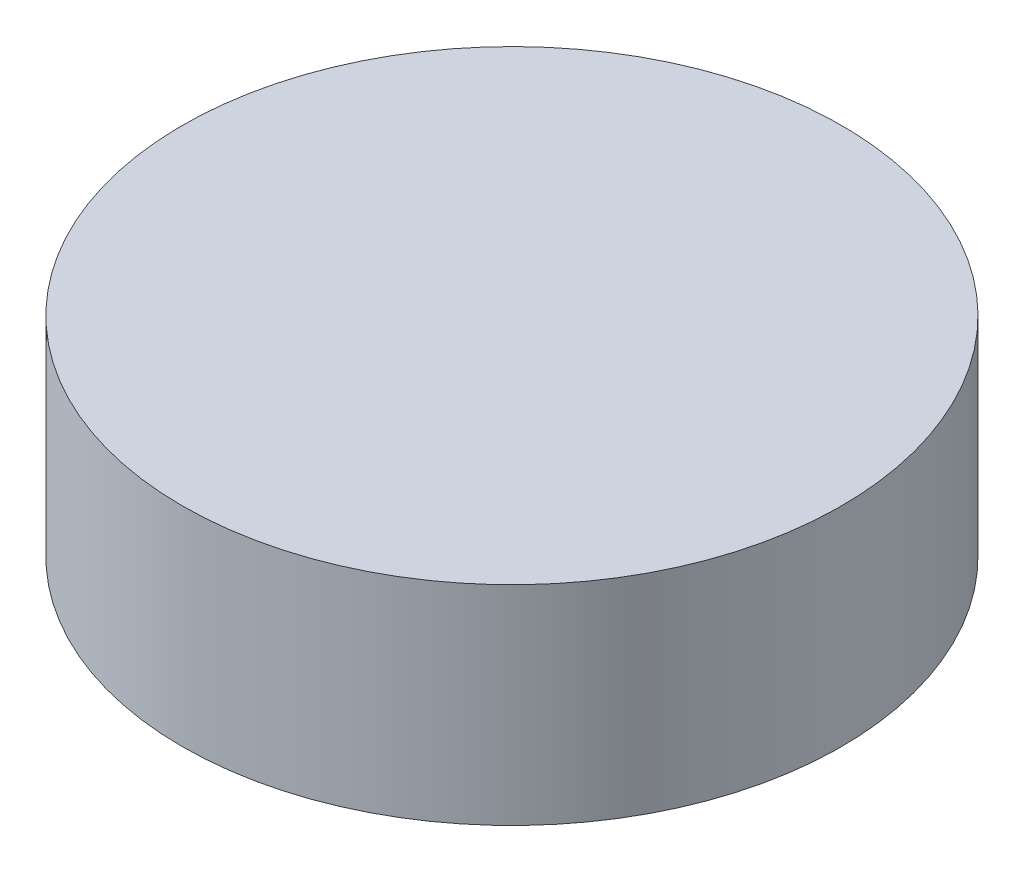
ISO-10303-21;
HEADER;
FILE_DESCRIPTION(('STEP AP214'),'2;1');
FILE_NAME('part.step','',(''),(''),'','','');
FILE_SCHEMA(('AUTOMOTIVE_DESIGN { 1 0 10303 214 1 1 1 1 }'));
ENDSEC;
DATA;
#1=APPLICATION_CONTEXT('core data for automotive mechanical design processes');
#2=APPLICATION_PROTOCOL_DEFINITION('international standard','automotive_design',2000,#1);
#3=PRODUCT_CONTEXT('',#1,'mechanical');
#4=PRODUCT('Part','Part','',(#3));
#5=PRODUCT_RELATED_PRODUCT_CATEGORY('part','',(#4));
#6=PRODUCT_DEFINITION_FORMATION('','',#4);
#7=PRODUCT_DEFINITION_CONTEXT('part definition',#1,'design');
#8=PRODUCT_DEFINITION('design','',#6,#7);
#9=PRODUCT_DEFINITION_SHAPE('','',#8);
#10=(LENGTH_UNIT() NAMED_UNIT(*) SI_UNIT(.MILLI.,.METRE.));
#11=(NAMED_UNIT(*) PLANE_ANGLE_UNIT() SI_UNIT($,.RADIAN.));
#12=(NAMED_UNIT(*) SI_UNIT($,.STERADIAN.) SOLID_ANGLE_UNIT());
#13=UNCERTAINTY_MEASURE_WITH_UNIT(LENGTH_MEASURE(1.E-05),#10,'distance_accuracy_value','');
#14=(GEOMETRIC_REPRESENTATION_CONTEXT(3) GLOBAL_UNCERTAINTY_ASSIGNED_CONTEXT((#13)) GLOBAL_UNIT_ASSIGNED_CONTEXT((#10,
#11,#12)) REPRESENTATION_CONTEXT('',''));
#15=CARTESIAN_POINT('',(0.,0.,0.));
#16=DIRECTION('',(0.,0.,1.));
#17=DIRECTION('',(1.,0.,0.));
#18=AXIS2_PLACEMENT_3D('',#15,#16,#17);
#19=CARTESIAN_POINT('',(47.292360797398,-149.719416551257,96.352860024077));
#20=DIRECTION('',(0.,1.,0.));
#21=DIRECTION('',(0.,0.,1.));
#22=AXIS2_PLACEMENT_3D('',#19,#20,#21);
#23=CYLINDRICAL_SURFACE('',#22,70.25);
#24=CARTESIAN_POINT('',(47.292360797398,48.9775889621627,96.352860024077));
#25=DIRECTION('',(0.,1.,0.));
#26=DIRECTION('',(0.,0.,1.));
#27=AXIS2_PLACEMENT_3D('',#24,#25,#26);
#28=CIRCLE('',#27,70.25);
#29=CARTESIAN_POINT('',(47.292360797398,48.9775889621626,166.602860024077));
#30=VERTEX_POINT('',#29);
#31=EDGE_CURVE('E10',#30,#30,#28,.F.);
#32=CARTESIAN_POINT('',(47.292360797398,93.4275889621627,96.352860024077));
#33=DIRECTION('',(0.,1.,0.));
#34=DIRECTION('',(0.,0.,1.));
#35=AXIS2_PLACEMENT_3D('',#32,#33,#34);
#36=CIRCLE('',#35,70.25);
#37=CARTESIAN_POINT('',(47.292360797398,93.4275889621626,166.602860024077));
#38=VERTEX_POINT('',#37);
#39=EDGE_CURVE('E38',#38,#38,#36,.T.);
#40=CARTESIAN_POINT('',(47.292360797398,48.9775889621626,166.602860024077));
#41=CARTESIAN_POINT('',(47.292360797398,49.440609795496,166.602860024077));
#42=CARTESIAN_POINT('',(47.292360797398,49.9036306288293,166.602860024077));
#43=CARTESIAN_POINT('',(47.292360797398,50.829672295496,166.602860024077));
#44=CARTESIAN_POINT('',(47.292360797398,51.2926931288293,166.602860024077));
#45=CARTESIAN_POINT('',(47.292360797398,52.218734795496,166.602860024077));
#46=CARTESIAN_POINT('',(47.292360797398,52.6817556288293,166.602860024077));
#47=CARTESIAN_POINT('',(47.292360797398,53.607797295496,166.602860024077));
#48=CARTESIAN_POINT('',(47.292360797398,54.0708181288293,166.602860024077));
#49=CARTESIAN_POINT('',(47.292360797398,54.996859795496,166.602860024077));
#50=CARTESIAN_POINT('',(47.292360797398,55.4598806288293,166.602860024077));
#51=CARTESIAN_POINT('',(47.292360797398,56.385922295496,166.602860024077));
#52=CARTESIAN_POINT('',(47.292360797398,56.8489431288293,166.602860024077));
#53=CARTESIAN_POINT('',(47.292360797398,57.774984795496,166.602860024077));
#54=CARTESIAN_POINT('',(47.292360797398,58.2380056288293,166.602860024077));
#55=CARTESIAN_POINT('',(47.292360797398,59.164047295496,166.602860024077));
#56=CARTESIAN_POINT('',(47.292360797398,59.6270681288293,166.602860024077));
#57=CARTESIAN_POINT('',(47.292360797398,60.553109795496,166.602860024077));
#58=CARTESIAN_POINT('',(47.292360797398,61.0161306288293,166.602860024077));
#59=CARTESIAN_POINT('',(47.292360797398,61.942172295496,166.602860024077));
#60=CARTESIAN_POINT('',(47.292360797398,62.4051931288293,166.602860024077));
#61=CARTESIAN_POINT('',(47.292360797398,63.331234795496,166.602860024077));
#62=CARTESIAN_POINT('',(47.292360797398,63.7942556288293,166.602860024077));
#63=CARTESIAN_POINT('',(47.292360797398,64.720297295496,166.602860024077));
#64=CARTESIAN_POINT('',(47.292360797398,65.1833181288293,166.602860024077));
#65=CARTESIAN_POINT('',(47.292360797398,66.109359795496,166.602860024077));
#66=CARTESIAN_POINT('',(47.292360797398,66.5723806288293,166.602860024077));
#67=CARTESIAN_POINT('',(47.292360797398,67.498422295496,166.602860024077));
#68=CARTESIAN_POINT('',(47.292360797398,67.9614431288293,166.602860024077));
#69=CARTESIAN_POINT('',(47.292360797398,68.887484795496,166.602860024077));
#70=CARTESIAN_POINT('',(47.292360797398,69.3505056288293,166.602860024077));
#71=CARTESIAN_POINT('',(47.292360797398,70.276547295496,166.602860024077));
#72=CARTESIAN_POINT('',(47.292360797398,70.7395681288293,166.602860024077));
#73=CARTESIAN_POINT('',(47.292360797398,71.665609795496,166.602860024077));
#74=CARTESIAN_POINT('',(47.292360797398,72.1286306288293,166.602860024077));
#75=CARTESIAN_POINT('',(47.292360797398,73.054672295496,166.602860024077));
#76=CARTESIAN_POINT('',(47.292360797398,73.5176931288293,166.602860024077));
#77=CARTESIAN_POINT('',(47.292360797398,74.443734795496,166.602860024077));
#78=CARTESIAN_POINT('',(47.292360797398,74.9067556288293,166.602860024077));
#79=CARTESIAN_POINT('',(47.292360797398,75.832797295496,166.602860024077));
#80=CARTESIAN_POINT('',(47.292360797398,76.2958181288293,166.602860024077));
#81=CARTESIAN_POINT('',(47.292360797398,77.221859795496,166.602860024077));
#82=CARTESIAN_POINT('',(47.292360797398,77.6848806288293,166.602860024077));
#83=CARTESIAN_POINT('',(47.292360797398,78.610922295496,166.602860024077));
#84=CARTESIAN_POINT('',(47.292360797398,79.0739431288293,166.602860024077));
#85=CARTESIAN_POINT('',(47.292360797398,79.999984795496,166.602860024077));
#86=CARTESIAN_POINT('',(47.292360797398,80.4630056288293,166.602860024077));
#87=CARTESIAN_POINT('',(47.292360797398,81.389047295496,166.602860024077));
#88=CARTESIAN_POINT('',(47.292360797398,81.8520681288293,166.602860024077));
#89=CARTESIAN_POINT('',(47.292360797398,82.778109795496,166.602860024077));
#90=CARTESIAN_POINT('',(47.292360797398,83.2411306288293,166.602860024077));
#91=CARTESIAN_POINT('',(47.292360797398,84.167172295496,166.602860024077));
#92=CARTESIAN_POINT('',(47.292360797398,84.6301931288293,166.602860024077));
#93=CARTESIAN_POINT('',(47.292360797398,85.556234795496,166.602860024077));
#94=CARTESIAN_POINT('',(47.292360797398,86.0192556288293,166.602860024077));
#95=CARTESIAN_POINT('',(47.292360797398,86.945297295496,166.602860024077));
#96=CARTESIAN_POINT('',(47.292360797398,87.4083181288293,166.602860024077));
#97=CARTESIAN_POINT('',(47.292360797398,88.334359795496,166.602860024077));
#98=CARTESIAN_POINT('',(47.292360797398,88.7973806288293,166.602860024077));
#99=CARTESIAN_POINT('',(47.292360797398,89.723422295496,166.602860024077));
#100=CARTESIAN_POINT('',(47.292360797398,90.1864431288293,166.602860024077));
#101=CARTESIAN_POINT('',(47.292360797398,91.112484795496,166.602860024077));
#102=CARTESIAN_POINT('',(47.292360797398,91.5755056288293,166.602860024077));
#103=CARTESIAN_POINT('',(47.292360797398,92.501547295496,166.602860024077));
#104=CARTESIAN_POINT('',(47.292360797398,92.9645681288293,166.602860024077));
#105=CARTESIAN_POINT('',(47.292360797398,93.4275889621626,166.602860024077));
#106=B_SPLINE_CURVE_WITH_KNOTS('',3,(#40,#41,#42,#43,#44,#45,#46,#47,#48,#49,#50,#51,#52,#53,
#54,#55,#56,#57,#58,#59,#60,#61,#62,#63,#64,#65,#66,#67,#68,#69,#70,#71,#72,#73,#74,#75,#76,#77,
#78,#79,#80,#81,#82,#83,#84,#85,#86,#87,#88,#89,#90,#91,#92,#93,#94,#95,#96,#97,#98,#99,#100,
#101,#102,#103,#104,#105),.UNSPECIFIED.,.F.,.F.,(4,2,2,2,2,2,2,2,2,2,2,2,2,2,2,2,2,2,2,2,2,2,2,
2,2,2,2,2,2,2,2,2,4),(0.,1.38906250000001,2.77812499999999,4.1671875,5.55624999999998,
6.94531249999999,8.334375,9.72343749999999,11.1125,12.5015625,13.890625,15.2796875,16.66875,
18.0578125,19.446875,20.8359375,22.225,23.6140625,25.003125,26.3921875,27.78125,29.1703125,
30.559375,31.9484375,33.3375,34.7265625,36.115625,37.5046875,38.89375,40.2828125,41.671875,
43.0609375,44.45),.UNSPECIFIED.);
#107=EDGE_CURVE('BSEAM32',#30,#38,#106,.T.);
#108=ORIENTED_EDGE('',*,*,#31,.F.);
#109=ORIENTED_EDGE('',*,*,#39,.F.);
#110=ORIENTED_EDGE('',*,*,#107,.T.);
#111=ORIENTED_EDGE('',*,*,#107,.F.);
#112=EDGE_LOOP('',(#108,#110,#109,#111));
#113=FACE_BOUND('',#112,.T.);
#114=ADVANCED_FACE('F32',(#113),#23,.T.);
#115=CARTESIAN_POINT('',(47.292360797398,93.4275889621627,96.352860024077));
#116=DIRECTION('',(0.,1.,0.));
#117=DIRECTION('',(0.,0.,1.));
#118=AXIS2_PLACEMENT_3D('',#115,#116,#117);
#119=PLANE('',#118);
#120=ORIENTED_EDGE('',*,*,#39,.T.);
#121=EDGE_LOOP('',(#120));
#122=FACE_BOUND('',#121,.T.);
#123=ADVANCED_FACE('F58',(#122),#119,.T.);
#124=CARTESIAN_POINT('',(47.292360797398,48.9775889621627,96.352860024077));
#125=DIRECTION('',(0.,1.,0.));
#126=DIRECTION('',(0.,0.,1.));
#127=AXIS2_PLACEMENT_3D('',#124,#125,#126);
#128=PLANE('',#127);
#129=CARTESIAN_POINT('',(47.292360797398,48.9775889621627,96.352860024077));
#130=DIRECTION('',(0.,-1.,0.));
#131=DIRECTION('',(0.,0.,-1.));
#132=AXIS2_PLACEMENT_3D('',#129,#130,#131);
#133=CIRCLE('',#132,63.9);
#134=CARTESIAN_POINT('',(47.292360797398,48.9775889621627,32.452860024077));
#135=VERTEX_POINT('',#134);
#136=EDGE_CURVE('E46',#135,#135,#133,.T.);
#137=ORIENTED_EDGE('',*,*,#136,.F.);
#138=EDGE_LOOP('',(#137));
#139=FACE_BOUND('',#138,.T.);
#140=ORIENTED_EDGE('',*,*,#31,.T.);
#141=EDGE_LOOP('',(#140));
#142=FACE_BOUND('',#141,.T.);
#143=ADVANCED_FACE('F55',(#139,#142),#128,.F.);
#144=CARTESIAN_POINT('',(47.292360797398,87.4775889621627,96.352860024077));
#145=DIRECTION('',(0.,1.,0.));
#146=DIRECTION('',(0.,0.,1.));
#147=AXIS2_PLACEMENT_3D('',#144,#145,#146);
#148=PLANE('',#147);
#149=CARTESIAN_POINT('',(47.292360797398,87.4775889621627,96.352860024077));
#150=DIRECTION('',(0.,1.,0.));
#151=DIRECTION('',(0.,0.,1.));
#152=AXIS2_PLACEMENT_3D('',#149,#150,#151);
#153=CIRCLE('',#152,63.9);
#154=CARTESIAN_POINT('',(47.292360797398,87.4775889621627,32.452860024077));
#155=VERTEX_POINT('',#154);
#156=EDGE_CURVE('E42',#155,#155,#153,.F.);
#157=ORIENTED_EDGE('',*,*,#156,.T.);
#158=EDGE_LOOP('',(#157));
#159=FACE_BOUND('',#158,.T.);
#160=ADVANCED_FACE('F57',(#159),#148,.F.);
#161=CARTESIAN_POINT('',(47.292360797398,268.614082233444,96.352860024077));
#162=DIRECTION('',(0.,-1.,0.));
#163=DIRECTION('',(0.,0.,-1.));
#164=AXIS2_PLACEMENT_3D('',#161,#162,#163);
#165=CYLINDRICAL_SURFACE('',#164,63.9);
#166=CARTESIAN_POINT('',(47.292360797398,48.9775889621627,32.452860024077));
#167=CARTESIAN_POINT('',(47.292360797398,49.3786306288293,32.452860024077));
#168=CARTESIAN_POINT('',(47.292360797398,49.779672295496,32.452860024077));
#169=CARTESIAN_POINT('',(47.292360797398,50.5817556288293,32.452860024077));
#170=CARTESIAN_POINT('',(47.292360797398,50.982797295496,32.452860024077));
#171=CARTESIAN_POINT('',(47.292360797398,51.7848806288293,32.452860024077));
#172=CARTESIAN_POINT('',(47.292360797398,52.185922295496,32.452860024077));
#173=CARTESIAN_POINT('',(47.292360797398,52.9880056288293,32.452860024077));
#174=CARTESIAN_POINT('',(47.292360797398,53.389047295496,32.452860024077));
#175=CARTESIAN_POINT('',(47.292360797398,54.1911306288293,32.452860024077));
#176=CARTESIAN_POINT('',(47.292360797398,54.592172295496,32.452860024077));
#177=CARTESIAN_POINT('',(47.292360797398,55.3942556288293,32.452860024077));
#178=CARTESIAN_POINT('',(47.292360797398,55.795297295496,32.452860024077));
#179=CARTESIAN_POINT('',(47.292360797398,56.5973806288293,32.452860024077));
#180=CARTESIAN_POINT('',(47.292360797398,56.998422295496,32.452860024077));
#181=CARTESIAN_POINT('',(47.292360797398,57.8005056288293,32.452860024077));
#182=CARTESIAN_POINT('',(47.292360797398,58.201547295496,32.452860024077));
#183=CARTESIAN_POINT('',(47.292360797398,59.0036306288293,32.452860024077));
#184=CARTESIAN_POINT('',(47.292360797398,59.404672295496,32.452860024077));
#185=CARTESIAN_POINT('',(47.292360797398,60.2067556288293,32.452860024077));
#186=CARTESIAN_POINT('',(47.292360797398,60.607797295496,32.452860024077));
#187=CARTESIAN_POINT('',(47.292360797398,61.4098806288293,32.452860024077));
#188=CARTESIAN_POINT('',(47.292360797398,61.810922295496,32.452860024077));
#189=CARTESIAN_POINT('',(47.292360797398,62.6130056288293,32.452860024077));
#190=CARTESIAN_POINT('',(47.292360797398,63.014047295496,32.452860024077));
#191=CARTESIAN_POINT('',(47.292360797398,63.8161306288293,32.452860024077));
#192=CARTESIAN_POINT('',(47.292360797398,64.217172295496,32.452860024077));
#193=CARTESIAN_POINT('',(47.292360797398,65.0192556288293,32.452860024077));
#194=CARTESIAN_POINT('',(47.292360797398,65.420297295496,32.452860024077));
#195=CARTESIAN_POINT('',(47.292360797398,66.2223806288293,32.452860024077));
#196=CARTESIAN_POINT('',(47.292360797398,66.623422295496,32.452860024077));
#197=CARTESIAN_POINT('',(47.292360797398,67.4255056288293,32.452860024077));
#198=CARTESIAN_POINT('',(47.292360797398,67.826547295496,32.452860024077));
#199=CARTESIAN_POINT('',(47.292360797398,68.6286306288293,32.452860024077));
#200=CARTESIAN_POINT('',(47.292360797398,69.029672295496,32.452860024077));
#201=CARTESIAN_POINT('',(47.292360797398,69.8317556288293,32.452860024077));
#202=CARTESIAN_POINT('',(47.292360797398,70.232797295496,32.452860024077));
#203=CARTESIAN_POINT('',(47.292360797398,71.0348806288293,32.452860024077));
#204=CARTESIAN_POINT('',(47.292360797398,71.435922295496,32.452860024077));
#205=CARTESIAN_POINT('',(47.292360797398,72.2380056288293,32.452860024077));
#206=CARTESIAN_POINT('',(47.292360797398,72.639047295496,32.452860024077));
#207=CARTESIAN_POINT('',(47.292360797398,73.4411306288293,32.452860024077));
#208=CARTESIAN_POINT('',(47.292360797398,73.842172295496,32.452860024077));
#209=CARTESIAN_POINT('',(47.292360797398,74.6442556288293,32.452860024077));
#210=CARTESIAN_POINT('',(47.292360797398,75.045297295496,32.452860024077));
#211=CARTESIAN_POINT('',(47.292360797398,75.8473806288293,32.452860024077));
#212=CARTESIAN_POINT('',(47.292360797398,76.248422295496,32.452860024077));
#213=CARTESIAN_POINT('',(47.292360797398,77.0505056288293,32.452860024077));
#214=CARTESIAN_POINT('',(47.292360797398,77.451547295496,32.452860024077));
#215=CARTESIAN_POINT('',(47.292360797398,78.2536306288293,32.452860024077));
#216=CARTESIAN_POINT('',(47.292360797398,78.654672295496,32.452860024077));
#217=CARTESIAN_POINT('',(47.292360797398,79.4567556288293,32.452860024077));
#218=CARTESIAN_POINT('',(47.292360797398,79.857797295496,32.452860024077));
#219=CARTESIAN_POINT('',(47.292360797398,80.6598806288293,32.452860024077));
#220=CARTESIAN_POINT('',(47.292360797398,81.060922295496,32.452860024077));
#221=CARTESIAN_POINT('',(47.292360797398,81.8630056288293,32.452860024077));
#222=CARTESIAN_POINT('',(47.292360797398,82.264047295496,32.452860024077));
#223=CARTESIAN_POINT('',(47.292360797398,83.0661306288293,32.452860024077));
#224=CARTESIAN_POINT('',(47.292360797398,83.467172295496,32.452860024077));
#225=CARTESIAN_POINT('',(47.292360797398,84.2692556288293,32.452860024077));
#226=CARTESIAN_POINT('',(47.292360797398,84.670297295496,32.452860024077));
#227=CARTESIAN_POINT('',(47.292360797398,85.4723806288293,32.452860024077));
#228=CARTESIAN_POINT('',(47.292360797398,85.873422295496,32.452860024077));
#229=CARTESIAN_POINT('',(47.292360797398,86.6755056288293,32.452860024077));
#230=CARTESIAN_POINT('',(47.292360797398,87.076547295496,32.452860024077));
#231=CARTESIAN_POINT('',(47.292360797398,87.4775889621627,32.452860024077));
#232=B_SPLINE_CURVE_WITH_KNOTS('',3,(#166,#167,#168,#169,#170,#171,#172,#173,#174,#175,#176,
#177,#178,#179,#180,#181,#182,#183,#184,#185,#186,#187,#188,#189,#190,#191,#192,#193,#194,#195,
#196,#197,#198,#199,#200,#201,#202,#203,#204,#205,#206,#207,#208,#209,#210,#211,#212,#213,#214,
#215,#216,#217,#218,#219,#220,#221,#222,#223,#224,#225,#226,#227,#228,#229,#230,#231),
.UNSPECIFIED.,.F.,.F.,(4,2,2,2,2,2,2,2,2,2,2,2,2,2,2,2,2,2,2,2,2,2,2,2,2,2,2,2,2,2,2,2,4),(0.,
1.203125,2.40625,3.609375,4.8125,6.015625,7.21875,8.42187499999999,9.62499999999999,10.828125,
12.03125,13.234375,14.4375,15.640625,16.84375,18.046875,19.25,20.453125,21.65625,22.859375,
24.0625,25.265625,26.46875,27.671875,28.875,30.078125,31.28125,32.484375,33.6875,34.890625,
36.09375,37.296875,38.5),.UNSPECIFIED.);
#233=EDGE_CURVE('BSEAM52',#135,#155,#232,.T.);
#234=ORIENTED_EDGE('',*,*,#136,.T.);
#235=ORIENTED_EDGE('',*,*,#156,.F.);
#236=ORIENTED_EDGE('',*,*,#233,.T.);
#237=ORIENTED_EDGE('',*,*,#233,.F.);
#238=EDGE_LOOP('',(#234,#236,#235,#237));
#239=FACE_BOUND('',#238,.T.);
#240=ADVANCED_FACE('F52',(#239),#165,.F.);
#241=CLOSED_SHELL('',(#114,#123,#143,#160,#240));
#242=MANIFOLD_SOLID_BREP('B2',#241);
#243=ADVANCED_BREP_SHAPE_REPRESENTATION('',(#18,#242),#14);
#244=SHAPE_DEFINITION_REPRESENTATION(#9,#243);
ENDSEC;
END-ISO-10303-21;
